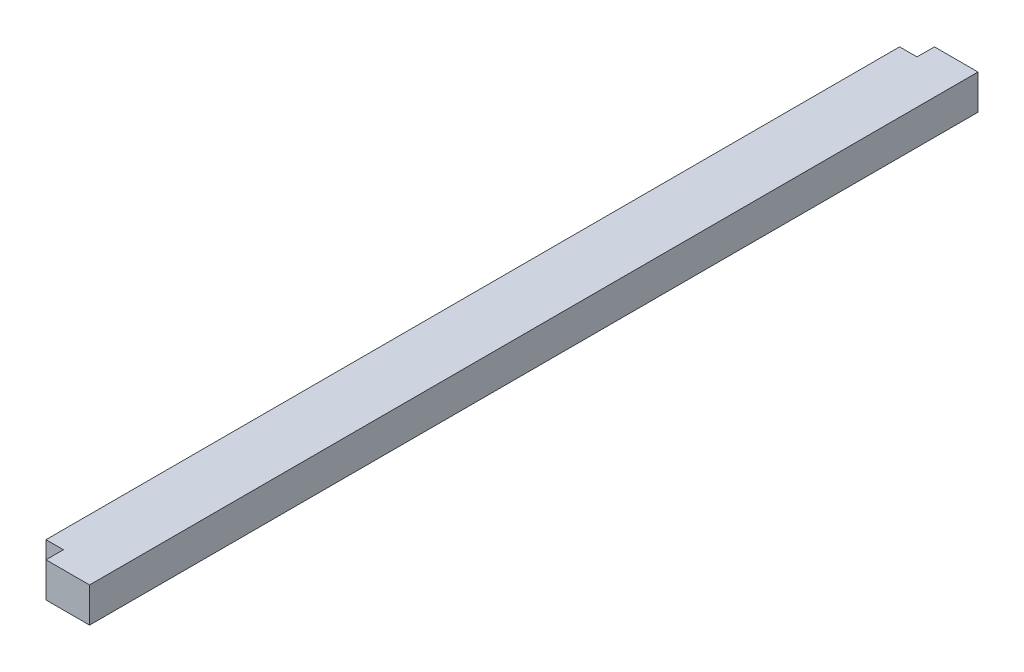
ISO-10303-21;
HEADER;
FILE_DESCRIPTION(('STEP AP214'),'2;1');
FILE_NAME('part.step','',(''),(''),'','','');
FILE_SCHEMA(('AUTOMOTIVE_DESIGN { 1 0 10303 214 1 1 1 1 }'));
ENDSEC;
DATA;
#1=APPLICATION_CONTEXT('core data for automotive mechanical design processes');
#2=APPLICATION_PROTOCOL_DEFINITION('international standard','automotive_design',2000,#1);
#3=PRODUCT_CONTEXT('',#1,'mechanical');
#4=PRODUCT('Part','Part','',(#3));
#5=PRODUCT_RELATED_PRODUCT_CATEGORY('part','',(#4));
#6=PRODUCT_DEFINITION_FORMATION('','',#4);
#7=PRODUCT_DEFINITION_CONTEXT('part definition',#1,'design');
#8=PRODUCT_DEFINITION('design','',#6,#7);
#9=PRODUCT_DEFINITION_SHAPE('','',#8);
#10=(LENGTH_UNIT() NAMED_UNIT(*) SI_UNIT(.MILLI.,.METRE.));
#11=(NAMED_UNIT(*) PLANE_ANGLE_UNIT() SI_UNIT($,.RADIAN.));
#12=(NAMED_UNIT(*) SI_UNIT($,.STERADIAN.) SOLID_ANGLE_UNIT());
#13=UNCERTAINTY_MEASURE_WITH_UNIT(LENGTH_MEASURE(1.E-05),#10,'distance_accuracy_value','');
#14=(GEOMETRIC_REPRESENTATION_CONTEXT(3) GLOBAL_UNCERTAINTY_ASSIGNED_CONTEXT((#13)) GLOBAL_UNIT_ASSIGNED_CONTEXT((#10,
#11,#12)) REPRESENTATION_CONTEXT('',''));
#15=CARTESIAN_POINT('',(0.,0.,0.));
#16=DIRECTION('',(0.,0.,1.));
#17=DIRECTION('',(1.,0.,0.));
#18=AXIS2_PLACEMENT_3D('',#15,#16,#17);
#19=CARTESIAN_POINT('',(0.,0.,-510.));
#20=DIRECTION('',(1.,0.,0.));
#21=DIRECTION('',(0.,0.,-1.));
#22=AXIS2_PLACEMENT_3D('',#19,#20,#21);
#23=PLANE('',#22);
#24=DIRECTION('',(0.,0.,1.));
#25=VECTOR('',#24,1.);
#26=CARTESIAN_POINT('',(0.,-10.,-510.));
#27=LINE('',#26,#25);
#28=CARTESIAN_POINT('',(0.,-10.,-500.));
#29=VERTEX_POINT('',#28);
#30=CARTESIAN_POINT('',(0.,-10.,-10.));
#31=VERTEX_POINT('',#30);
#32=EDGE_CURVE('E120',#29,#31,#27,.T.);
#33=ORIENTED_EDGE('',*,*,#32,.T.);
#34=DIRECTION('',(0.,1.,0.));
#35=VECTOR('',#34,1.);
#36=CARTESIAN_POINT('',(0.,-20.,-10.));
#37=LINE('',#36,#35);
#38=CARTESIAN_POINT('',(0.,0.,-10.));
#39=VERTEX_POINT('',#38);
#40=EDGE_CURVE('E105',#31,#39,#37,.T.);
#41=ORIENTED_EDGE('',*,*,#40,.T.);
#42=DIRECTION('',(0.,0.,1.));
#43=VECTOR('',#42,1.);
#44=CARTESIAN_POINT('',(0.,0.,-510.));
#45=LINE('',#44,#43);
#46=CARTESIAN_POINT('',(0.,0.,-500.));
#47=VERTEX_POINT('',#46);
#48=EDGE_CURVE('E118',#47,#39,#45,.T.);
#49=ORIENTED_EDGE('',*,*,#48,.F.);
#50=DIRECTION('',(0.,1.,0.));
#51=VECTOR('',#50,1.);
#52=CARTESIAN_POINT('',(0.,-20.,-500.));
#53=LINE('',#52,#51);
#54=EDGE_CURVE('E155',#29,#47,#53,.T.);
#55=ORIENTED_EDGE('',*,*,#54,.F.);
#56=EDGE_LOOP('',(#33,#41,#49,#55));
#57=FACE_BOUND('',#56,.T.);
#58=ADVANCED_FACE('F34',(#57),#23,.F.);
#59=CARTESIAN_POINT('',(0.,0.,-510.));
#60=DIRECTION('',(0.,-1.,0.));
#61=DIRECTION('',(0.,0.,-1.));
#62=AXIS2_PLACEMENT_3D('',#59,#60,#61);
#63=PLANE('',#62);
#64=ORIENTED_EDGE('',*,*,#48,.T.);
#65=DIRECTION('',(-1.,0.,0.));
#66=VECTOR('',#65,1.);
#67=CARTESIAN_POINT('',(0.,0.,-10.));
#68=LINE('',#67,#66);
#69=CARTESIAN_POINT('',(10.,0.,-10.));
#70=VERTEX_POINT('',#69);
#71=EDGE_CURVE('E102',#70,#39,#68,.T.);
#72=ORIENTED_EDGE('',*,*,#71,.F.);
#73=DIRECTION('',(0.,0.,-1.));
#74=VECTOR('',#73,1.);
#75=CARTESIAN_POINT('',(10.,0.,-10.));
#76=LINE('',#75,#74);
#77=CARTESIAN_POINT('',(10.,0.,0.));
#78=VERTEX_POINT('',#77);
#79=EDGE_CURVE('E112',#78,#70,#76,.T.);
#80=ORIENTED_EDGE('',*,*,#79,.F.);
#81=DIRECTION('',(1.,0.,0.));
#82=VECTOR('',#81,1.);
#83=CARTESIAN_POINT('',(0.,0.,0.));
#84=LINE('',#83,#82);
#85=CARTESIAN_POINT('',(35.,0.,0.));
#86=VERTEX_POINT('',#85);
#87=EDGE_CURVE('E147',#78,#86,#84,.T.);
#88=ORIENTED_EDGE('',*,*,#87,.T.);
#89=DIRECTION('',(0.,0.,1.));
#90=VECTOR('',#89,1.);
#91=CARTESIAN_POINT('',(35.,0.,-510.));
#92=LINE('',#91,#90);
#93=CARTESIAN_POINT('',(35.,0.,-510.));
#94=VERTEX_POINT('',#93);
#95=EDGE_CURVE('E127',#94,#86,#92,.T.);
#96=ORIENTED_EDGE('',*,*,#95,.F.);
#97=DIRECTION('',(1.,0.,0.));
#98=VECTOR('',#97,1.);
#99=CARTESIAN_POINT('',(0.,0.,-510.));
#100=LINE('',#99,#98);
#101=CARTESIAN_POINT('',(10.,0.,-510.));
#102=VERTEX_POINT('',#101);
#103=EDGE_CURVE('E73',#102,#94,#100,.T.);
#104=ORIENTED_EDGE('',*,*,#103,.F.);
#105=DIRECTION('',(0.,0.,-1.));
#106=VECTOR('',#105,1.);
#107=CARTESIAN_POINT('',(10.,0.,-500.));
#108=LINE('',#107,#106);
#109=CARTESIAN_POINT('',(10.,0.,-500.));
#110=VERTEX_POINT('',#109);
#111=EDGE_CURVE('E157',#110,#102,#108,.T.);
#112=ORIENTED_EDGE('',*,*,#111,.F.);
#113=DIRECTION('',(1.,0.,0.));
#114=VECTOR('',#113,1.);
#115=CARTESIAN_POINT('',(0.,0.,-500.));
#116=LINE('',#115,#114);
#117=EDGE_CURVE('E126',#47,#110,#116,.T.);
#118=ORIENTED_EDGE('',*,*,#117,.F.);
#119=EDGE_LOOP('',(#64,#72,#80,#88,#96,#104,#112,#118));
#120=FACE_BOUND('',#119,.T.);
#121=ADVANCED_FACE('F123',(#120),#63,.F.);
#122=CARTESIAN_POINT('',(35.,0.,-510.));
#123=DIRECTION('',(-1.,0.,0.));
#124=DIRECTION('',(0.,0.,1.));
#125=AXIS2_PLACEMENT_3D('',#122,#123,#124);
#126=PLANE('',#125);
#127=DIRECTION('',(0.,-1.,0.));
#128=VECTOR('',#127,1.);
#129=CARTESIAN_POINT('',(35.,0.,0.));
#130=LINE('',#129,#128);
#131=CARTESIAN_POINT('',(35.,-20.,0.));
#132=VERTEX_POINT('',#131);
#133=EDGE_CURVE('E145',#86,#132,#130,.T.);
#134=ORIENTED_EDGE('',*,*,#133,.T.);
#135=DIRECTION('',(0.,0.,1.));
#136=VECTOR('',#135,1.);
#137=CARTESIAN_POINT('',(35.,-20.,-510.));
#138=LINE('',#137,#136);
#139=CARTESIAN_POINT('',(35.,-20.,-510.));
#140=VERTEX_POINT('',#139);
#141=EDGE_CURVE('E131',#140,#132,#138,.T.);
#142=ORIENTED_EDGE('',*,*,#141,.F.);
#143=DIRECTION('',(0.,-1.,0.));
#144=VECTOR('',#143,1.);
#145=CARTESIAN_POINT('',(35.,0.,-510.));
#146=LINE('',#145,#144);
#147=EDGE_CURVE('E152',#94,#140,#146,.T.);
#148=ORIENTED_EDGE('',*,*,#147,.F.);
#149=ORIENTED_EDGE('',*,*,#95,.T.);
#150=EDGE_LOOP('',(#134,#142,#148,#149));
#151=FACE_BOUND('',#150,.T.);
#152=ADVANCED_FACE('F172',(#151),#126,.F.);
#153=CARTESIAN_POINT('',(10.,-20.,-510.));
#154=DIRECTION('',(0.,1.,0.));
#155=DIRECTION('',(0.,0.,1.));
#156=AXIS2_PLACEMENT_3D('',#153,#154,#155);
#157=PLANE('',#156);
#158=DIRECTION('',(-1.,0.,0.));
#159=VECTOR('',#158,1.);
#160=CARTESIAN_POINT('',(10.,-20.,0.));
#161=LINE('',#160,#159);
#162=CARTESIAN_POINT('',(10.,-20.,0.));
#163=VERTEX_POINT('',#162);
#164=EDGE_CURVE('E143',#132,#163,#161,.T.);
#165=ORIENTED_EDGE('',*,*,#164,.T.);
#166=DIRECTION('',(0.,0.,1.));
#167=VECTOR('',#166,1.);
#168=CARTESIAN_POINT('',(10.,-20.,-510.));
#169=LINE('',#168,#167);
#170=CARTESIAN_POINT('',(10.,-20.,-510.));
#171=VERTEX_POINT('',#170);
#172=EDGE_CURVE('E70',#171,#163,#169,.T.);
#173=ORIENTED_EDGE('',*,*,#172,.F.);
#174=DIRECTION('',(-1.,0.,0.));
#175=VECTOR('',#174,1.);
#176=CARTESIAN_POINT('',(10.,-20.,-510.));
#177=LINE('',#176,#175);
#178=EDGE_CURVE('E54',#140,#171,#177,.T.);
#179=ORIENTED_EDGE('',*,*,#178,.F.);
#180=ORIENTED_EDGE('',*,*,#141,.T.);
#181=EDGE_LOOP('',(#165,#173,#179,#180));
#182=FACE_BOUND('',#181,.T.);
#183=ADVANCED_FACE('F175',(#182),#157,.F.);
#184=CARTESIAN_POINT('',(10.,-10.,-510.));
#185=DIRECTION('',(1.,0.,0.));
#186=DIRECTION('',(0.,0.,-1.));
#187=AXIS2_PLACEMENT_3D('',#184,#185,#186);
#188=PLANE('',#187);
#189=ORIENTED_EDGE('',*,*,#172,.T.);
#190=DIRECTION('',(0.,1.,0.));
#191=VECTOR('',#190,1.);
#192=CARTESIAN_POINT('',(10.,-10.,0.));
#193=LINE('',#192,#191);
#194=EDGE_CURVE('E141',#163,#78,#193,.T.);
#195=ORIENTED_EDGE('',*,*,#194,.T.);
#196=ORIENTED_EDGE('',*,*,#79,.T.);
#197=DIRECTION('',(0.,1.,0.));
#198=VECTOR('',#197,1.);
#199=CARTESIAN_POINT('',(10.,-20.,-10.));
#200=LINE('',#199,#198);
#201=CARTESIAN_POINT('',(10.,-10.,-10.));
#202=VERTEX_POINT('',#201);
#203=EDGE_CURVE('E107',#202,#70,#200,.T.);
#204=ORIENTED_EDGE('',*,*,#203,.F.);
#205=DIRECTION('',(0.,0.,1.));
#206=VECTOR('',#205,1.);
#207=CARTESIAN_POINT('',(10.,-10.,-510.));
#208=LINE('',#207,#206);
#209=CARTESIAN_POINT('',(10.,-10.,-500.));
#210=VERTEX_POINT('',#209);
#211=EDGE_CURVE('E137',#210,#202,#208,.T.);
#212=ORIENTED_EDGE('',*,*,#211,.F.);
#213=DIRECTION('',(0.,1.,0.));
#214=VECTOR('',#213,1.);
#215=CARTESIAN_POINT('',(10.,-20.,-500.));
#216=LINE('',#215,#214);
#217=EDGE_CURVE('E149',#210,#110,#216,.T.);
#218=ORIENTED_EDGE('',*,*,#217,.T.);
#219=ORIENTED_EDGE('',*,*,#111,.T.);
#220=DIRECTION('',(0.,1.,0.));
#221=VECTOR('',#220,1.);
#222=CARTESIAN_POINT('',(10.,-10.,-510.));
#223=LINE('',#222,#221);
#224=EDGE_CURVE('E48',#171,#102,#223,.T.);
#225=ORIENTED_EDGE('',*,*,#224,.F.);
#226=EDGE_LOOP('',(#189,#195,#196,#204,#212,#218,#219,#225));
#227=FACE_BOUND('',#226,.T.);
#228=ADVANCED_FACE('F162',(#227),#188,.F.);
#229=CARTESIAN_POINT('',(0.,-10.,-510.));
#230=DIRECTION('',(0.,1.,0.));
#231=DIRECTION('',(0.,0.,1.));
#232=AXIS2_PLACEMENT_3D('',#229,#230,#231);
#233=PLANE('',#232);
#234=ORIENTED_EDGE('',*,*,#211,.T.);
#235=DIRECTION('',(-1.,0.,0.));
#236=VECTOR('',#235,1.);
#237=CARTESIAN_POINT('',(0.,-10.,-10.));
#238=LINE('',#237,#236);
#239=EDGE_CURVE('E11',#202,#31,#238,.T.);
#240=ORIENTED_EDGE('',*,*,#239,.T.);
#241=ORIENTED_EDGE('',*,*,#32,.F.);
#242=DIRECTION('',(1.,0.,0.));
#243=VECTOR('',#242,1.);
#244=CARTESIAN_POINT('',(0.,-10.,-500.));
#245=LINE('',#244,#243);
#246=EDGE_CURVE('E41',#29,#210,#245,.T.);
#247=ORIENTED_EDGE('',*,*,#246,.T.);
#248=EDGE_LOOP('',(#234,#240,#241,#247));
#249=FACE_BOUND('',#248,.T.);
#250=ADVANCED_FACE('F178',(#249),#233,.F.);
#251=CARTESIAN_POINT('',(0.,0.,-510.));
#252=DIRECTION('',(0.,0.,1.));
#253=DIRECTION('',(1.,0.,0.));
#254=AXIS2_PLACEMENT_3D('',#251,#252,#253);
#255=PLANE('',#254);
#256=ORIENTED_EDGE('',*,*,#224,.T.);
#257=ORIENTED_EDGE('',*,*,#103,.T.);
#258=ORIENTED_EDGE('',*,*,#147,.T.);
#259=ORIENTED_EDGE('',*,*,#178,.T.);
#260=EDGE_LOOP('',(#256,#257,#258,#259));
#261=FACE_BOUND('',#260,.T.);
#262=ADVANCED_FACE('F176',(#261),#255,.F.);
#263=CARTESIAN_POINT('',(0.,0.,0.));
#264=DIRECTION('',(0.,0.,1.));
#265=DIRECTION('',(1.,0.,0.));
#266=AXIS2_PLACEMENT_3D('',#263,#264,#265);
#267=PLANE('',#266);
#268=ORIENTED_EDGE('',*,*,#87,.F.);
#269=ORIENTED_EDGE('',*,*,#194,.F.);
#270=ORIENTED_EDGE('',*,*,#164,.F.);
#271=ORIENTED_EDGE('',*,*,#133,.F.);
#272=EDGE_LOOP('',(#268,#269,#270,#271));
#273=FACE_BOUND('',#272,.T.);
#274=ADVANCED_FACE('F168',(#273),#267,.T.);
#275=CARTESIAN_POINT('',(0.,-20.,-500.));
#276=DIRECTION('',(0.,0.,1.));
#277=DIRECTION('',(1.,0.,0.));
#278=AXIS2_PLACEMENT_3D('',#275,#276,#277);
#279=PLANE('',#278);
#280=ORIENTED_EDGE('',*,*,#54,.T.);
#281=ORIENTED_EDGE('',*,*,#117,.T.);
#282=ORIENTED_EDGE('',*,*,#217,.F.);
#283=ORIENTED_EDGE('',*,*,#246,.F.);
#284=EDGE_LOOP('',(#280,#281,#282,#283));
#285=FACE_BOUND('',#284,.T.);
#286=ADVANCED_FACE('F184',(#285),#279,.F.);
#287=CARTESIAN_POINT('',(0.,-20.,-10.));
#288=DIRECTION('',(0.,0.,-1.));
#289=DIRECTION('',(-1.,0.,0.));
#290=AXIS2_PLACEMENT_3D('',#287,#288,#289);
#291=PLANE('',#290);
#292=ORIENTED_EDGE('',*,*,#203,.T.);
#293=ORIENTED_EDGE('',*,*,#71,.T.);
#294=ORIENTED_EDGE('',*,*,#40,.F.);
#295=ORIENTED_EDGE('',*,*,#239,.F.);
#296=EDGE_LOOP('',(#292,#293,#294,#295));
#297=FACE_BOUND('',#296,.T.);
#298=ADVANCED_FACE('F104',(#297),#291,.F.);
#299=CLOSED_SHELL('',(#58,#121,#152,#183,#228,#250,#262,#274,#286,#298));
#300=MANIFOLD_SOLID_BREP('B2',#299);
#301=ADVANCED_BREP_SHAPE_REPRESENTATION('',(#18,#300),#14);
#302=SHAPE_DEFINITION_REPRESENTATION(#9,#301);
ENDSEC;
END-ISO-10303-21;
